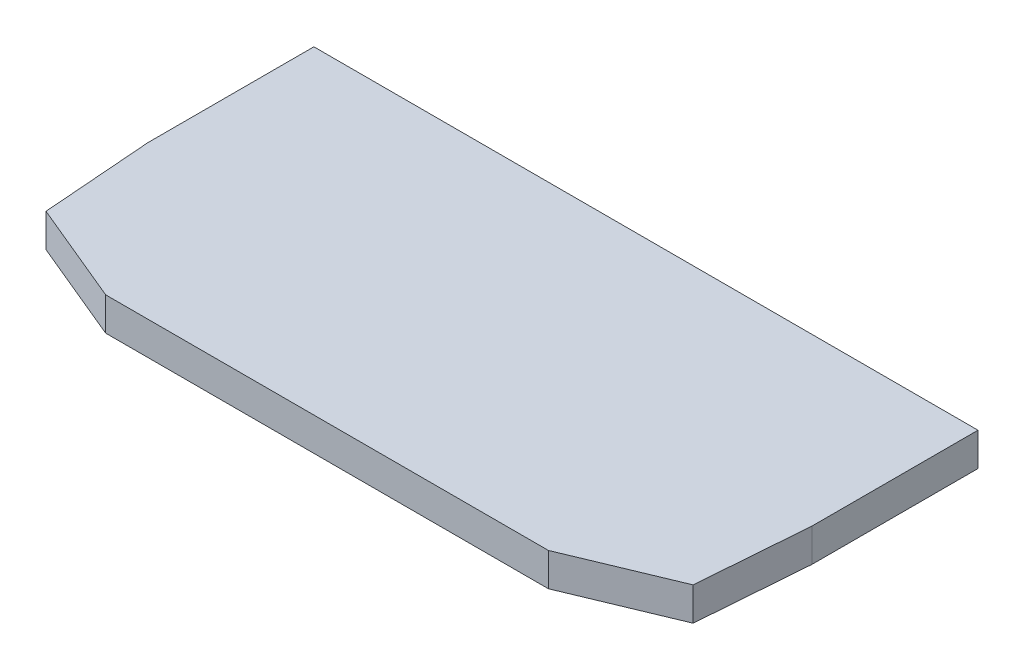
ISO-10303-21;
HEADER;
FILE_DESCRIPTION(('STEP AP214'),'2;1');
FILE_NAME('part.step','',(''),(''),'','','');
FILE_SCHEMA(('AUTOMOTIVE_DESIGN { 1 0 10303 214 1 1 1 1 }'));
ENDSEC;
DATA;
#1=APPLICATION_CONTEXT('core data for automotive mechanical design processes');
#2=APPLICATION_PROTOCOL_DEFINITION('international standard','automotive_design',2000,#1);
#3=PRODUCT_CONTEXT('',#1,'mechanical');
#4=PRODUCT('Part','Part','',(#3));
#5=PRODUCT_RELATED_PRODUCT_CATEGORY('part','',(#4));
#6=PRODUCT_DEFINITION_FORMATION('','',#4);
#7=PRODUCT_DEFINITION_CONTEXT('part definition',#1,'design');
#8=PRODUCT_DEFINITION('design','',#6,#7);
#9=PRODUCT_DEFINITION_SHAPE('','',#8);
#10=(LENGTH_UNIT() NAMED_UNIT(*) SI_UNIT(.MILLI.,.METRE.));
#11=(NAMED_UNIT(*) PLANE_ANGLE_UNIT() SI_UNIT($,.RADIAN.));
#12=(NAMED_UNIT(*) SI_UNIT($,.STERADIAN.) SOLID_ANGLE_UNIT());
#13=UNCERTAINTY_MEASURE_WITH_UNIT(LENGTH_MEASURE(1.E-05),#10,'distance_accuracy_value','');
#14=(GEOMETRIC_REPRESENTATION_CONTEXT(3) GLOBAL_UNCERTAINTY_ASSIGNED_CONTEXT((#13)) GLOBAL_UNIT_ASSIGNED_CONTEXT((#10,
#11,#12)) REPRESENTATION_CONTEXT('',''));
#15=CARTESIAN_POINT('',(0.,0.,0.));
#16=DIRECTION('',(0.,0.,1.));
#17=DIRECTION('',(1.,0.,0.));
#18=AXIS2_PLACEMENT_3D('',#15,#16,#17);
#19=CARTESIAN_POINT('',(-27.1417787533344,3.,-11.1200485490036));
#20=DIRECTION('',(1.,0.,0.));
#21=DIRECTION('',(0.,0.,-1.));
#22=AXIS2_PLACEMENT_3D('',#19,#20,#21);
#23=PLANE('',#22);
#24=DIRECTION('',(0.,0.,1.));
#25=VECTOR('',#24,1.);
#26=CARTESIAN_POINT('',(-27.1417787533344,0.,-11.1200485490036));
#27=LINE('',#26,#25);
#28=CARTESIAN_POINT('',(-27.1417787533344,0.,-11.1200485490036));
#29=VERTEX_POINT('',#28);
#30=CARTESIAN_POINT('',(-27.1417787533344,0.,3.87995145099643));
#31=VERTEX_POINT('',#30);
#32=EDGE_CURVE('E135',#29,#31,#27,.T.);
#33=ORIENTED_EDGE('',*,*,#32,.T.);
#34=DIRECTION('',(0.,-1.,0.));
#35=VECTOR('',#34,1.);
#36=CARTESIAN_POINT('',(-27.1417787533344,3.,3.87995145099643));
#37=LINE('',#36,#35);
#38=CARTESIAN_POINT('',(-27.1417787533344,3.,3.87995145099643));
#39=VERTEX_POINT('',#38);
#40=EDGE_CURVE('E11',#39,#31,#37,.T.);
#41=ORIENTED_EDGE('',*,*,#40,.F.);
#42=DIRECTION('',(0.,0.,1.));
#43=VECTOR('',#42,1.);
#44=CARTESIAN_POINT('',(-27.1417787533344,3.,-11.1200485490036));
#45=LINE('',#44,#43);
#46=CARTESIAN_POINT('',(-27.1417787533344,3.,-11.1200485490036));
#47=VERTEX_POINT('',#46);
#48=EDGE_CURVE('E151',#47,#39,#45,.T.);
#49=ORIENTED_EDGE('',*,*,#48,.F.);
#50=DIRECTION('',(0.,-1.,0.));
#51=VECTOR('',#50,1.);
#52=CARTESIAN_POINT('',(-27.1417787533344,3.,-11.1200485490036));
#53=LINE('',#52,#51);
#54=EDGE_CURVE('E54',#47,#29,#53,.T.);
#55=ORIENTED_EDGE('',*,*,#54,.T.);
#56=EDGE_LOOP('',(#33,#41,#49,#55));
#57=FACE_BOUND('',#56,.T.);
#58=ADVANCED_FACE('F38',(#57),#23,.F.);
#59=CARTESIAN_POINT('',(-27.1417787533344,3.,3.87995145099643));
#60=DIRECTION('',(0.997048821180151,0.,-0.0767700995392737));
#61=DIRECTION('',(-0.0767700995392737,0.,-0.997048821180152));
#62=AXIS2_PLACEMENT_3D('',#59,#60,#61);
#63=PLANE('',#62);
#64=DIRECTION('',(0.0767700995392737,0.,0.997048821180152));
#65=VECTOR('',#64,1.);
#66=CARTESIAN_POINT('',(-27.1417787533344,0.,3.87995145099643));
#67=LINE('',#66,#65);
#68=CARTESIAN_POINT('',(-26.3740777579417,0.,13.8504396627979));
#69=VERTEX_POINT('',#68);
#70=EDGE_CURVE('E137',#31,#69,#67,.T.);
#71=ORIENTED_EDGE('',*,*,#70,.T.);
#72=DIRECTION('',(0.,-1.,0.));
#73=VECTOR('',#72,1.);
#74=CARTESIAN_POINT('',(-26.3740777579417,3.,13.8504396627979));
#75=LINE('',#74,#73);
#76=CARTESIAN_POINT('',(-26.3740777579417,3.,13.8504396627979));
#77=VERTEX_POINT('',#76);
#78=EDGE_CURVE('E46',#77,#69,#75,.T.);
#79=ORIENTED_EDGE('',*,*,#78,.F.);
#80=DIRECTION('',(0.0767700995392737,0.,0.997048821180152));
#81=VECTOR('',#80,1.);
#82=CARTESIAN_POINT('',(-27.1417787533344,3.,3.87995145099643));
#83=LINE('',#82,#81);
#84=EDGE_CURVE('E92',#39,#77,#83,.T.);
#85=ORIENTED_EDGE('',*,*,#84,.F.);
#86=ORIENTED_EDGE('',*,*,#40,.T.);
#87=EDGE_LOOP('',(#71,#79,#85,#86));
#88=FACE_BOUND('',#87,.T.);
#89=ADVANCED_FACE('F183',(#88),#63,.F.);
#90=CARTESIAN_POINT('',(-26.3740777579417,3.,13.8504396627979));
#91=DIRECTION('',(0.384248033040216,0.,-0.923229900460727));
#92=DIRECTION('',(-0.923229900460728,0.,-0.384248033040216));
#93=AXIS2_PLACEMENT_3D('',#90,#91,#92);
#94=PLANE('',#93);
#95=DIRECTION('',(0.923229900460728,0.,0.384248033040216));
#96=VECTOR('',#95,1.);
#97=CARTESIAN_POINT('',(-26.3740777579417,0.,13.8504396627979));
#98=LINE('',#97,#96);
#99=CARTESIAN_POINT('',(-17.1417787533344,0.,17.6929199932001));
#100=VERTEX_POINT('',#99);
#101=EDGE_CURVE('E139',#69,#100,#98,.T.);
#102=ORIENTED_EDGE('',*,*,#101,.T.);
#103=DIRECTION('',(0.,-1.,0.));
#104=VECTOR('',#103,1.);
#105=CARTESIAN_POINT('',(-17.1417787533344,3.,17.6929199932001));
#106=LINE('',#105,#104);
#107=CARTESIAN_POINT('',(-17.1417787533344,3.,17.6929199932001));
#108=VERTEX_POINT('',#107);
#109=EDGE_CURVE('E158',#108,#100,#106,.T.);
#110=ORIENTED_EDGE('',*,*,#109,.F.);
#111=DIRECTION('',(0.923229900460728,0.,0.384248033040216));
#112=VECTOR('',#111,1.);
#113=CARTESIAN_POINT('',(-26.3740777579417,3.,13.8504396627979));
#114=LINE('',#113,#112);
#115=EDGE_CURVE('E166',#77,#108,#114,.T.);
#116=ORIENTED_EDGE('',*,*,#115,.F.);
#117=ORIENTED_EDGE('',*,*,#78,.T.);
#118=EDGE_LOOP('',(#102,#110,#116,#117));
#119=FACE_BOUND('',#118,.T.);
#120=ADVANCED_FACE('F164',(#119),#94,.F.);
#121=CARTESIAN_POINT('',(-17.1417787533344,3.,17.6929199932001));
#122=DIRECTION('',(0.,0.,-1.));
#123=DIRECTION('',(-1.,0.,0.));
#124=AXIS2_PLACEMENT_3D('',#121,#122,#123);
#125=PLANE('',#124);
#126=DIRECTION('',(1.,0.,0.));
#127=VECTOR('',#126,1.);
#128=CARTESIAN_POINT('',(-17.1417787533344,0.,17.6929199932001));
#129=LINE('',#128,#127);
#130=CARTESIAN_POINT('',(22.8582212466656,0.,17.6929199932001));
#131=VERTEX_POINT('',#130);
#132=EDGE_CURVE('E141',#100,#131,#129,.T.);
#133=ORIENTED_EDGE('',*,*,#132,.T.);
#134=DIRECTION('',(0.,-1.,0.));
#135=VECTOR('',#134,1.);
#136=CARTESIAN_POINT('',(22.8582212466656,3.,17.6929199932001));
#137=LINE('',#136,#135);
#138=CARTESIAN_POINT('',(22.8582212466656,3.,17.6929199932001));
#139=VERTEX_POINT('',#138);
#140=EDGE_CURVE('E155',#139,#131,#137,.T.);
#141=ORIENTED_EDGE('',*,*,#140,.F.);
#142=DIRECTION('',(1.,0.,0.));
#143=VECTOR('',#142,1.);
#144=CARTESIAN_POINT('',(-17.1417787533344,3.,17.6929199932001));
#145=LINE('',#144,#143);
#146=EDGE_CURVE('E177',#108,#139,#145,.T.);
#147=ORIENTED_EDGE('',*,*,#146,.F.);
#148=ORIENTED_EDGE('',*,*,#109,.T.);
#149=EDGE_LOOP('',(#133,#141,#147,#148));
#150=FACE_BOUND('',#149,.T.);
#151=ADVANCED_FACE('F173',(#150),#125,.F.);
#152=CARTESIAN_POINT('',(22.8582212466656,3.,17.6929199932001));
#153=DIRECTION('',(-0.384248033040219,0.,-0.923229900460726));
#154=DIRECTION('',(-0.923229900460727,0.,0.384248033040219));
#155=AXIS2_PLACEMENT_3D('',#152,#153,#154);
#156=PLANE('',#155);
#157=DIRECTION('',(0.923229900460726,0.,-0.384248033040219));
#158=VECTOR('',#157,1.);
#159=CARTESIAN_POINT('',(22.8582212466656,0.,17.6929199932001));
#160=LINE('',#159,#158);
#161=CARTESIAN_POINT('',(32.0905202512728,0.,13.8504396627979));
#162=VERTEX_POINT('',#161);
#163=EDGE_CURVE('E143',#131,#162,#160,.T.);
#164=ORIENTED_EDGE('',*,*,#163,.T.);
#165=DIRECTION('',(0.,-1.,0.));
#166=VECTOR('',#165,1.);
#167=CARTESIAN_POINT('',(32.0905202512728,3.,13.8504396627979));
#168=LINE('',#167,#166);
#169=CARTESIAN_POINT('',(32.0905202512728,3.,13.8504396627979));
#170=VERTEX_POINT('',#169);
#171=EDGE_CURVE('E127',#170,#162,#168,.T.);
#172=ORIENTED_EDGE('',*,*,#171,.F.);
#173=DIRECTION('',(0.923229900460726,0.,-0.384248033040219));
#174=VECTOR('',#173,1.);
#175=CARTESIAN_POINT('',(22.8582212466656,3.,17.6929199932001));
#176=LINE('',#175,#174);
#177=EDGE_CURVE('E115',#139,#170,#176,.T.);
#178=ORIENTED_EDGE('',*,*,#177,.F.);
#179=ORIENTED_EDGE('',*,*,#140,.T.);
#180=EDGE_LOOP('',(#164,#172,#178,#179));
#181=FACE_BOUND('',#180,.T.);
#182=ADVANCED_FACE('F176',(#181),#156,.F.);
#183=CARTESIAN_POINT('',(32.0905202512728,3.,13.8504396627979));
#184=DIRECTION('',(-0.997048821180152,0.,-0.0767700995392723));
#185=DIRECTION('',(-0.0767700995392723,0.,0.997048821180152));
#186=AXIS2_PLACEMENT_3D('',#183,#184,#185);
#187=PLANE('',#186);
#188=DIRECTION('',(0.0767700995392723,0.,-0.997048821180152));
#189=VECTOR('',#188,1.);
#190=CARTESIAN_POINT('',(32.0905202512728,0.,13.8504396627979));
#191=LINE('',#190,#189);
#192=CARTESIAN_POINT('',(32.8582212466656,0.,3.8799514509964));
#193=VERTEX_POINT('',#192);
#194=EDGE_CURVE('E124',#162,#193,#191,.T.);
#195=ORIENTED_EDGE('',*,*,#194,.T.);
#196=DIRECTION('',(0.,-1.,0.));
#197=VECTOR('',#196,1.);
#198=CARTESIAN_POINT('',(32.8582212466656,3.,3.8799514509964));
#199=LINE('',#198,#197);
#200=CARTESIAN_POINT('',(32.8582212466656,3.,3.8799514509964));
#201=VERTEX_POINT('',#200);
#202=EDGE_CURVE('E121',#201,#193,#199,.T.);
#203=ORIENTED_EDGE('',*,*,#202,.F.);
#204=DIRECTION('',(0.0767700995392723,0.,-0.997048821180152));
#205=VECTOR('',#204,1.);
#206=CARTESIAN_POINT('',(32.0905202512728,3.,13.8504396627979));
#207=LINE('',#206,#205);
#208=EDGE_CURVE('E108',#170,#201,#207,.T.);
#209=ORIENTED_EDGE('',*,*,#208,.F.);
#210=ORIENTED_EDGE('',*,*,#171,.T.);
#211=EDGE_LOOP('',(#195,#203,#209,#210));
#212=FACE_BOUND('',#211,.T.);
#213=ADVANCED_FACE('F122',(#212),#187,.F.);
#214=CARTESIAN_POINT('',(32.8582212466656,3.,-11.1200485490036));
#215=DIRECTION('',(1.,0.,0.));
#216=DIRECTION('',(0.,0.,-1.));
#217=AXIS2_PLACEMENT_3D('',#214,#215,#216);
#218=PLANE('',#217);
#219=DIRECTION('',(0.,0.,1.));
#220=VECTOR('',#219,1.);
#221=CARTESIAN_POINT('',(32.8582212466656,0.,-11.1200485490036));
#222=LINE('',#221,#220);
#223=CARTESIAN_POINT('',(32.8582212466656,0.,-11.1200485490036));
#224=VERTEX_POINT('',#223);
#225=EDGE_CURVE('E146',#224,#193,#222,.T.);
#226=ORIENTED_EDGE('',*,*,#225,.F.);
#227=DIRECTION('',(0.,-1.,0.));
#228=VECTOR('',#227,1.);
#229=CARTESIAN_POINT('',(32.8582212466656,3.,-11.1200485490036));
#230=LINE('',#229,#228);
#231=CARTESIAN_POINT('',(32.8582212466656,3.,-11.1200485490036));
#232=VERTEX_POINT('',#231);
#233=EDGE_CURVE('E80',#232,#224,#230,.T.);
#234=ORIENTED_EDGE('',*,*,#233,.F.);
#235=DIRECTION('',(0.,0.,1.));
#236=VECTOR('',#235,1.);
#237=CARTESIAN_POINT('',(32.8582212466656,3.,-11.1200485490036));
#238=LINE('',#237,#236);
#239=EDGE_CURVE('E113',#232,#201,#238,.T.);
#240=ORIENTED_EDGE('',*,*,#239,.T.);
#241=ORIENTED_EDGE('',*,*,#202,.T.);
#242=EDGE_LOOP('',(#226,#234,#240,#241));
#243=FACE_BOUND('',#242,.T.);
#244=ADVANCED_FACE('F129',(#243),#218,.T.);
#245=CARTESIAN_POINT('',(-27.1417787533344,3.,-11.1200485490036));
#246=DIRECTION('',(0.,0.,-1.));
#247=DIRECTION('',(-1.,0.,0.));
#248=AXIS2_PLACEMENT_3D('',#245,#246,#247);
#249=PLANE('',#248);
#250=DIRECTION('',(1.,0.,0.));
#251=VECTOR('',#250,1.);
#252=CARTESIAN_POINT('',(-27.1417787533344,0.,-11.1200485490036));
#253=LINE('',#252,#251);
#254=EDGE_CURVE('E148',#29,#224,#253,.T.);
#255=ORIENTED_EDGE('',*,*,#254,.F.);
#256=ORIENTED_EDGE('',*,*,#54,.F.);
#257=DIRECTION('',(1.,0.,0.));
#258=VECTOR('',#257,1.);
#259=CARTESIAN_POINT('',(-27.1417787533344,3.,-11.1200485490036));
#260=LINE('',#259,#258);
#261=EDGE_CURVE('E130',#47,#232,#260,.T.);
#262=ORIENTED_EDGE('',*,*,#261,.T.);
#263=ORIENTED_EDGE('',*,*,#233,.T.);
#264=EDGE_LOOP('',(#255,#256,#262,#263));
#265=FACE_BOUND('',#264,.T.);
#266=ADVANCED_FACE('F199',(#265),#249,.T.);
#267=CARTESIAN_POINT('',(0.,3.,0.));
#268=DIRECTION('',(0.,1.,0.));
#269=DIRECTION('',(0.,0.,1.));
#270=AXIS2_PLACEMENT_3D('',#267,#268,#269);
#271=PLANE('',#270);
#272=ORIENTED_EDGE('',*,*,#48,.T.);
#273=ORIENTED_EDGE('',*,*,#84,.T.);
#274=ORIENTED_EDGE('',*,*,#115,.T.);
#275=ORIENTED_EDGE('',*,*,#146,.T.);
#276=ORIENTED_EDGE('',*,*,#177,.T.);
#277=ORIENTED_EDGE('',*,*,#208,.T.);
#278=ORIENTED_EDGE('',*,*,#239,.F.);
#279=ORIENTED_EDGE('',*,*,#261,.F.);
#280=EDGE_LOOP('',(#272,#273,#274,#275,#276,#277,#278,#279));
#281=FACE_BOUND('',#280,.T.);
#282=ADVANCED_FACE('F110',(#281),#271,.T.);
#283=CARTESIAN_POINT('',(0.,0.,0.));
#284=DIRECTION('',(0.,1.,0.));
#285=DIRECTION('',(0.,0.,1.));
#286=AXIS2_PLACEMENT_3D('',#283,#284,#285);
#287=PLANE('',#286);
#288=ORIENTED_EDGE('',*,*,#32,.F.);
#289=ORIENTED_EDGE('',*,*,#254,.T.);
#290=ORIENTED_EDGE('',*,*,#225,.T.);
#291=ORIENTED_EDGE('',*,*,#194,.F.);
#292=ORIENTED_EDGE('',*,*,#163,.F.);
#293=ORIENTED_EDGE('',*,*,#132,.F.);
#294=ORIENTED_EDGE('',*,*,#101,.F.);
#295=ORIENTED_EDGE('',*,*,#70,.F.);
#296=EDGE_LOOP('',(#288,#289,#290,#291,#292,#293,#294,#295));
#297=FACE_BOUND('',#296,.T.);
#298=ADVANCED_FACE('F169',(#297),#287,.F.);
#299=CLOSED_SHELL('',(#58,#89,#120,#151,#182,#213,#244,#266,#282,#298));
#300=MANIFOLD_SOLID_BREP('B2',#299);
#301=ADVANCED_BREP_SHAPE_REPRESENTATION('',(#18,#300),#14);
#302=SHAPE_DEFINITION_REPRESENTATION(#9,#301);
ENDSEC;
END-ISO-10303-21;
